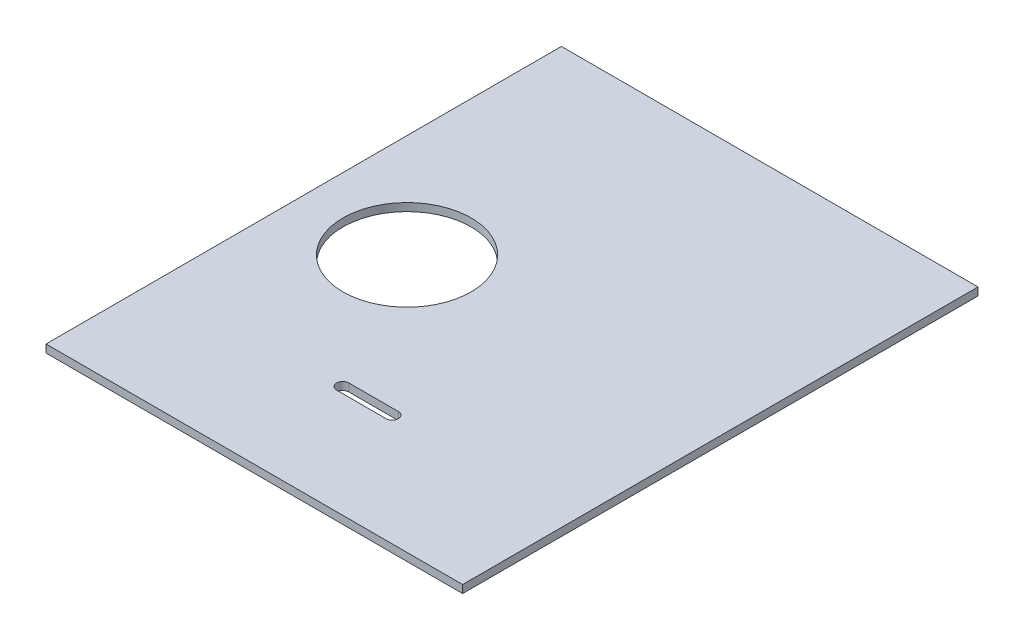
ISO-10303-21;
HEADER;
FILE_DESCRIPTION(('STEP AP214'),'2;1');
FILE_NAME('part.step','',(''),(''),'','','');
FILE_SCHEMA(('AUTOMOTIVE_DESIGN { 1 0 10303 214 1 1 1 1 }'));
ENDSEC;
DATA;
#1=APPLICATION_CONTEXT('core data for automotive mechanical design processes');
#2=APPLICATION_PROTOCOL_DEFINITION('international standard','automotive_design',2000,#1);
#3=PRODUCT_CONTEXT('',#1,'mechanical');
#4=PRODUCT('Part','Part','',(#3));
#5=PRODUCT_RELATED_PRODUCT_CATEGORY('part','',(#4));
#6=PRODUCT_DEFINITION_FORMATION('','',#4);
#7=PRODUCT_DEFINITION_CONTEXT('part definition',#1,'design');
#8=PRODUCT_DEFINITION('design','',#6,#7);
#9=PRODUCT_DEFINITION_SHAPE('','',#8);
#10=(LENGTH_UNIT() NAMED_UNIT(*) SI_UNIT(.MILLI.,.METRE.));
#11=(NAMED_UNIT(*) PLANE_ANGLE_UNIT() SI_UNIT($,.RADIAN.));
#12=(NAMED_UNIT(*) SI_UNIT($,.STERADIAN.) SOLID_ANGLE_UNIT());
#13=UNCERTAINTY_MEASURE_WITH_UNIT(LENGTH_MEASURE(1.E-05),#10,'distance_accuracy_value','');
#14=(GEOMETRIC_REPRESENTATION_CONTEXT(3) GLOBAL_UNCERTAINTY_ASSIGNED_CONTEXT((#13)) GLOBAL_UNIT_ASSIGNED_CONTEXT((#10,
#11,#12)) REPRESENTATION_CONTEXT('',''));
#15=CARTESIAN_POINT('',(0.,0.,0.));
#16=DIRECTION('',(0.,0.,1.));
#17=DIRECTION('',(1.,0.,0.));
#18=AXIS2_PLACEMENT_3D('',#15,#16,#17);
#19=CARTESIAN_POINT('',(84.325,3.18,104.325));
#20=DIRECTION('',(-1.,0.,0.));
#21=DIRECTION('',(0.,0.,1.));
#22=AXIS2_PLACEMENT_3D('',#19,#20,#21);
#23=PLANE('',#22);
#24=DIRECTION('',(0.,0.,-1.));
#25=VECTOR('',#24,1.);
#26=CARTESIAN_POINT('',(84.325,0.,104.325));
#27=LINE('',#26,#25);
#28=CARTESIAN_POINT('',(84.325,0.,104.325));
#29=VERTEX_POINT('',#28);
#30=CARTESIAN_POINT('',(84.325,0.,-104.325));
#31=VERTEX_POINT('',#30);
#32=EDGE_CURVE('E102',#29,#31,#27,.T.);
#33=ORIENTED_EDGE('',*,*,#32,.T.);
#34=DIRECTION('',(0.,-1.,0.));
#35=VECTOR('',#34,1.);
#36=CARTESIAN_POINT('',(84.325,3.18,-104.325));
#37=LINE('',#36,#35);
#38=CARTESIAN_POINT('',(84.325,3.18,-104.325));
#39=VERTEX_POINT('',#38);
#40=EDGE_CURVE('E11',#39,#31,#37,.T.);
#41=ORIENTED_EDGE('',*,*,#40,.F.);
#42=DIRECTION('',(0.,0.,-1.));
#43=VECTOR('',#42,1.);
#44=CARTESIAN_POINT('',(84.325,3.18,104.325));
#45=LINE('',#44,#43);
#46=CARTESIAN_POINT('',(84.325,3.18,104.325));
#47=VERTEX_POINT('',#46);
#48=EDGE_CURVE('E131',#47,#39,#45,.T.);
#49=ORIENTED_EDGE('',*,*,#48,.F.);
#50=DIRECTION('',(0.,-1.,0.));
#51=VECTOR('',#50,1.);
#52=CARTESIAN_POINT('',(84.325,3.18,104.325));
#53=LINE('',#52,#51);
#54=EDGE_CURVE('E141',#47,#29,#53,.T.);
#55=ORIENTED_EDGE('',*,*,#54,.T.);
#56=EDGE_LOOP('',(#33,#41,#49,#55));
#57=FACE_BOUND('',#56,.T.);
#58=ADVANCED_FACE('F32',(#57),#23,.F.);
#59=CARTESIAN_POINT('',(-84.325,3.18,-104.325));
#60=DIRECTION('',(0.,0.,1.));
#61=DIRECTION('',(1.,0.,0.));
#62=AXIS2_PLACEMENT_3D('',#59,#60,#61);
#63=PLANE('',#62);
#64=DIRECTION('',(-1.,0.,0.));
#65=VECTOR('',#64,1.);
#66=CARTESIAN_POINT('',(-84.325,0.,-104.325));
#67=LINE('',#66,#65);
#68=CARTESIAN_POINT('',(-84.325,0.,-104.325));
#69=VERTEX_POINT('',#68);
#70=EDGE_CURVE('E144',#31,#69,#67,.T.);
#71=ORIENTED_EDGE('',*,*,#70,.T.);
#72=DIRECTION('',(0.,-1.,0.));
#73=VECTOR('',#72,1.);
#74=CARTESIAN_POINT('',(-84.325,3.18,-104.325));
#75=LINE('',#74,#73);
#76=CARTESIAN_POINT('',(-84.325,3.18,-104.325));
#77=VERTEX_POINT('',#76);
#78=EDGE_CURVE('E39',#77,#69,#75,.T.);
#79=ORIENTED_EDGE('',*,*,#78,.F.);
#80=DIRECTION('',(-1.,0.,0.));
#81=VECTOR('',#80,1.);
#82=CARTESIAN_POINT('',(-84.325,3.18,-104.325));
#83=LINE('',#82,#81);
#84=EDGE_CURVE('E134',#39,#77,#83,.T.);
#85=ORIENTED_EDGE('',*,*,#84,.F.);
#86=ORIENTED_EDGE('',*,*,#40,.T.);
#87=EDGE_LOOP('',(#71,#79,#85,#86));
#88=FACE_BOUND('',#87,.T.);
#89=ADVANCED_FACE('F172',(#88),#63,.F.);
#90=CARTESIAN_POINT('',(-84.325,3.18,104.325));
#91=DIRECTION('',(1.,0.,0.));
#92=DIRECTION('',(0.,0.,-1.));
#93=AXIS2_PLACEMENT_3D('',#90,#91,#92);
#94=PLANE('',#93);
#95=DIRECTION('',(0.,0.,1.));
#96=VECTOR('',#95,1.);
#97=CARTESIAN_POINT('',(-84.325,0.,104.325));
#98=LINE('',#97,#96);
#99=CARTESIAN_POINT('',(-84.325,0.,104.325));
#100=VERTEX_POINT('',#99);
#101=EDGE_CURVE('E146',#69,#100,#98,.T.);
#102=ORIENTED_EDGE('',*,*,#101,.T.);
#103=DIRECTION('',(0.,-1.,0.));
#104=VECTOR('',#103,1.);
#105=CARTESIAN_POINT('',(-84.325,3.18,104.325));
#106=LINE('',#105,#104);
#107=CARTESIAN_POINT('',(-84.325,3.18,104.325));
#108=VERTEX_POINT('',#107);
#109=EDGE_CURVE('E151',#108,#100,#106,.T.);
#110=ORIENTED_EDGE('',*,*,#109,.F.);
#111=DIRECTION('',(0.,0.,1.));
#112=VECTOR('',#111,1.);
#113=CARTESIAN_POINT('',(-84.325,3.18,104.325));
#114=LINE('',#113,#112);
#115=EDGE_CURVE('E137',#77,#108,#114,.T.);
#116=ORIENTED_EDGE('',*,*,#115,.F.);
#117=ORIENTED_EDGE('',*,*,#78,.T.);
#118=EDGE_LOOP('',(#102,#110,#116,#117));
#119=FACE_BOUND('',#118,.T.);
#120=ADVANCED_FACE('F158',(#119),#94,.F.);
#121=CARTESIAN_POINT('',(-84.325,3.18,104.325));
#122=DIRECTION('',(0.,0.,-1.));
#123=DIRECTION('',(-1.,0.,0.));
#124=AXIS2_PLACEMENT_3D('',#121,#122,#123);
#125=PLANE('',#124);
#126=DIRECTION('',(1.,0.,0.));
#127=VECTOR('',#126,1.);
#128=CARTESIAN_POINT('',(-84.325,0.,104.325));
#129=LINE('',#128,#127);
#130=EDGE_CURVE('E135',#100,#29,#129,.T.);
#131=ORIENTED_EDGE('',*,*,#130,.T.);
#132=ORIENTED_EDGE('',*,*,#54,.F.);
#133=DIRECTION('',(1.,0.,0.));
#134=VECTOR('',#133,1.);
#135=CARTESIAN_POINT('',(-84.325,3.18,104.325));
#136=LINE('',#135,#134);
#137=EDGE_CURVE('E139',#108,#47,#136,.T.);
#138=ORIENTED_EDGE('',*,*,#137,.F.);
#139=ORIENTED_EDGE('',*,*,#109,.T.);
#140=EDGE_LOOP('',(#131,#132,#138,#139));
#141=FACE_BOUND('',#140,.T.);
#142=ADVANCED_FACE('F165',(#141),#125,.F.);
#143=CARTESIAN_POINT('',(0.,3.18,0.));
#144=DIRECTION('',(0.,-1.,0.));
#145=DIRECTION('',(0.,0.,-1.));
#146=AXIS2_PLACEMENT_3D('',#143,#144,#145);
#147=PLANE('',#146);
#148=CARTESIAN_POINT('',(-42.4824999999876,3.18,-2.22044604925031E-12));
#149=DIRECTION('',(0.,1.,0.));
#150=DIRECTION('',(0.,0.,1.));
#151=AXIS2_PLACEMENT_3D('',#148,#149,#150);
#152=CIRCLE('',#151,25.9511033983043);
#153=CARTESIAN_POINT('',(-42.4824999999876,3.18,25.9511033983021));
#154=VERTEX_POINT('',#153);
#155=EDGE_CURVE('E211',#154,#154,#152,.T.);
#156=ORIENTED_EDGE('',*,*,#155,.F.);
#157=EDGE_LOOP('',(#156));
#158=FACE_BOUND('',#157,.T.);
#159=DIRECTION('',(1.,0.,0.));
#160=VECTOR('',#159,1.);
#161=CARTESIAN_POINT('',(-9.32500000000008,3.18,61.6749999999998));
#162=LINE('',#161,#160);
#163=CARTESIAN_POINT('',(-9.32500000000008,3.18,61.6749999999998));
#164=VERTEX_POINT('',#163);
#165=CARTESIAN_POINT('',(10.6749999999999,3.18,61.6749999999998));
#166=VERTEX_POINT('',#165);
#167=EDGE_CURVE('E115',#164,#166,#162,.T.);
#168=ORIENTED_EDGE('',*,*,#167,.F.);
#169=CARTESIAN_POINT('',(-9.32500000000008,3.18,59.1749999999998));
#170=DIRECTION('',(0.,1.,0.));
#171=DIRECTION('',(0.,0.,1.));
#172=AXIS2_PLACEMENT_3D('',#169,#170,#171);
#173=CIRCLE('',#172,2.5);
#174=CARTESIAN_POINT('',(-9.32500000000008,3.18,56.6749999999998));
#175=VERTEX_POINT('',#174);
#176=EDGE_CURVE('E46',#175,#164,#173,.T.);
#177=ORIENTED_EDGE('',*,*,#176,.F.);
#178=DIRECTION('',(-1.,0.,0.));
#179=VECTOR('',#178,1.);
#180=CARTESIAN_POINT('',(10.6749999999999,3.18,56.6749999999998));
#181=LINE('',#180,#179);
#182=CARTESIAN_POINT('',(10.6749999999999,3.18,56.6749999999998));
#183=VERTEX_POINT('',#182);
#184=EDGE_CURVE('E108',#183,#175,#181,.T.);
#185=ORIENTED_EDGE('',*,*,#184,.F.);
#186=CARTESIAN_POINT('',(10.6749999999999,3.18,59.1749999999998));
#187=DIRECTION('',(0.,1.,0.));
#188=DIRECTION('',(0.,0.,1.));
#189=AXIS2_PLACEMENT_3D('',#186,#187,#188);
#190=CIRCLE('',#189,2.5);
#191=EDGE_CURVE('E122',#166,#183,#190,.T.);
#192=ORIENTED_EDGE('',*,*,#191,.F.);
#193=EDGE_LOOP('',(#168,#177,#185,#192));
#194=FACE_BOUND('',#193,.T.);
#195=ORIENTED_EDGE('',*,*,#48,.T.);
#196=ORIENTED_EDGE('',*,*,#84,.T.);
#197=ORIENTED_EDGE('',*,*,#115,.T.);
#198=ORIENTED_EDGE('',*,*,#137,.T.);
#199=EDGE_LOOP('',(#195,#196,#197,#198));
#200=FACE_BOUND('',#199,.T.);
#201=ADVANCED_FACE('F171',(#158,#194,#200),#147,.F.);
#202=CARTESIAN_POINT('',(0.,0.,0.));
#203=DIRECTION('',(0.,-1.,0.));
#204=DIRECTION('',(0.,0.,-1.));
#205=AXIS2_PLACEMENT_3D('',#202,#203,#204);
#206=PLANE('',#205);
#207=CARTESIAN_POINT('',(-42.4824999999876,0.,-2.22044604925031E-12));
#208=DIRECTION('',(0.,-1.,0.));
#209=DIRECTION('',(0.,0.,-1.));
#210=AXIS2_PLACEMENT_3D('',#207,#208,#209);
#211=CIRCLE('',#210,25.9511033983043);
#212=CARTESIAN_POINT('',(-42.4824999999876,0.,25.9511033983021));
#213=VERTEX_POINT('',#212);
#214=EDGE_CURVE('E208',#213,#213,#211,.F.);
#215=ORIENTED_EDGE('',*,*,#214,.T.);
#216=EDGE_LOOP('',(#215));
#217=FACE_BOUND('',#216,.T.);
#218=CARTESIAN_POINT('',(-9.32500000000008,0.,59.1749999999998));
#219=DIRECTION('',(0.,-1.,0.));
#220=DIRECTION('',(0.,0.,-1.));
#221=AXIS2_PLACEMENT_3D('',#218,#219,#220);
#222=CIRCLE('',#221,2.5);
#223=CARTESIAN_POINT('',(-9.32500000000008,0.,56.6749999999998));
#224=VERTEX_POINT('',#223);
#225=CARTESIAN_POINT('',(-9.32500000000008,0.,61.6749999999998));
#226=VERTEX_POINT('',#225);
#227=EDGE_CURVE('E106',#224,#226,#222,.F.);
#228=ORIENTED_EDGE('',*,*,#227,.T.);
#229=DIRECTION('',(1.,0.,0.));
#230=VECTOR('',#229,1.);
#231=CARTESIAN_POINT('',(-9.32500000000008,0.,61.6749999999998));
#232=LINE('',#231,#230);
#233=CARTESIAN_POINT('',(10.6749999999999,0.,61.6749999999998));
#234=VERTEX_POINT('',#233);
#235=EDGE_CURVE('E95',#226,#234,#232,.T.);
#236=ORIENTED_EDGE('',*,*,#235,.T.);
#237=CARTESIAN_POINT('',(10.6749999999999,0.,59.1749999999998));
#238=DIRECTION('',(0.,-1.,0.));
#239=DIRECTION('',(0.,0.,-1.));
#240=AXIS2_PLACEMENT_3D('',#237,#238,#239);
#241=CIRCLE('',#240,2.5);
#242=CARTESIAN_POINT('',(10.6749999999999,0.,56.6749999999998));
#243=VERTEX_POINT('',#242);
#244=EDGE_CURVE('E117',#234,#243,#241,.F.);
#245=ORIENTED_EDGE('',*,*,#244,.T.);
#246=DIRECTION('',(-1.,0.,0.));
#247=VECTOR('',#246,1.);
#248=CARTESIAN_POINT('',(10.6749999999999,0.,56.6749999999998));
#249=LINE('',#248,#247);
#250=EDGE_CURVE('E113',#243,#224,#249,.T.);
#251=ORIENTED_EDGE('',*,*,#250,.T.);
#252=EDGE_LOOP('',(#228,#236,#245,#251));
#253=FACE_BOUND('',#252,.T.);
#254=ORIENTED_EDGE('',*,*,#32,.F.);
#255=ORIENTED_EDGE('',*,*,#130,.F.);
#256=ORIENTED_EDGE('',*,*,#101,.F.);
#257=ORIENTED_EDGE('',*,*,#70,.F.);
#258=EDGE_LOOP('',(#254,#255,#256,#257));
#259=FACE_BOUND('',#258,.T.);
#260=ADVANCED_FACE('F111',(#217,#253,#259),#206,.T.);
#261=CARTESIAN_POINT('',(-9.32500000000008,-0.00100000000000013,59.1749999999998));
#262=DIRECTION('',(0.,1.,0.));
#263=DIRECTION('',(0.,0.,1.));
#264=AXIS2_PLACEMENT_3D('',#261,#262,#263);
#265=CYLINDRICAL_SURFACE('',#264,2.5);
#266=DIRECTION('',(0.,1.,0.));
#267=VECTOR('',#266,1.);
#268=CARTESIAN_POINT('',(-9.32500000000008,-0.00100000000000013,56.6749999999998));
#269=LINE('',#268,#267);
#270=EDGE_CURVE('E103',#224,#175,#269,.T.);
#271=ORIENTED_EDGE('',*,*,#270,.T.);
#272=ORIENTED_EDGE('',*,*,#176,.T.);
#273=DIRECTION('',(0.,1.,0.));
#274=VECTOR('',#273,1.);
#275=CARTESIAN_POINT('',(-9.32500000000008,-0.00100000000000013,61.6749999999998));
#276=LINE('',#275,#274);
#277=EDGE_CURVE('E97',#226,#164,#276,.T.);
#278=ORIENTED_EDGE('',*,*,#277,.F.);
#279=ORIENTED_EDGE('',*,*,#227,.F.);
#280=EDGE_LOOP('',(#271,#272,#278,#279));
#281=FACE_BOUND('',#280,.T.);
#282=ADVANCED_FACE('F105',(#281),#265,.F.);
#283=CARTESIAN_POINT('',(10.6749999999999,-0.00100000000000013,56.6749999999998));
#284=DIRECTION('',(0.,0.,-1.));
#285=DIRECTION('',(-1.,0.,0.));
#286=AXIS2_PLACEMENT_3D('',#283,#284,#285);
#287=PLANE('',#286);
#288=DIRECTION('',(0.,1.,0.));
#289=VECTOR('',#288,1.);
#290=CARTESIAN_POINT('',(10.6749999999999,-0.00100000000000013,56.6749999999998));
#291=LINE('',#290,#289);
#292=EDGE_CURVE('E128',#243,#183,#291,.T.);
#293=ORIENTED_EDGE('',*,*,#292,.T.);
#294=ORIENTED_EDGE('',*,*,#184,.T.);
#295=ORIENTED_EDGE('',*,*,#270,.F.);
#296=ORIENTED_EDGE('',*,*,#250,.F.);
#297=EDGE_LOOP('',(#293,#294,#295,#296));
#298=FACE_BOUND('',#297,.T.);
#299=ADVANCED_FACE('F190',(#298),#287,.F.);
#300=CARTESIAN_POINT('',(10.6749999999999,-0.00100000000000013,59.1749999999998));
#301=DIRECTION('',(0.,1.,0.));
#302=DIRECTION('',(0.,0.,1.));
#303=AXIS2_PLACEMENT_3D('',#300,#301,#302);
#304=CYLINDRICAL_SURFACE('',#303,2.5);
#305=DIRECTION('',(0.,1.,0.));
#306=VECTOR('',#305,1.);
#307=CARTESIAN_POINT('',(10.6749999999999,-0.00100000000000013,61.6749999999998));
#308=LINE('',#307,#306);
#309=EDGE_CURVE('E54',#234,#166,#308,.T.);
#310=ORIENTED_EDGE('',*,*,#309,.T.);
#311=ORIENTED_EDGE('',*,*,#191,.T.);
#312=ORIENTED_EDGE('',*,*,#292,.F.);
#313=ORIENTED_EDGE('',*,*,#244,.F.);
#314=EDGE_LOOP('',(#310,#311,#312,#313));
#315=FACE_BOUND('',#314,.T.);
#316=ADVANCED_FACE('F194',(#315),#304,.F.);
#317=CARTESIAN_POINT('',(-9.32500000000008,-0.00100000000000013,61.6749999999998));
#318=DIRECTION('',(0.,0.,1.));
#319=DIRECTION('',(1.,0.,0.));
#320=AXIS2_PLACEMENT_3D('',#317,#318,#319);
#321=PLANE('',#320);
#322=ORIENTED_EDGE('',*,*,#277,.T.);
#323=ORIENTED_EDGE('',*,*,#167,.T.);
#324=ORIENTED_EDGE('',*,*,#309,.F.);
#325=ORIENTED_EDGE('',*,*,#235,.F.);
#326=EDGE_LOOP('',(#322,#323,#324,#325));
#327=FACE_BOUND('',#326,.T.);
#328=ADVANCED_FACE('F96',(#327),#321,.F.);
#329=CARTESIAN_POINT('',(-42.4824999999876,-0.00100000000000013,-2.22044604925031E-12));
#330=DIRECTION('',(0.,1.,0.));
#331=DIRECTION('',(0.,0.,1.));
#332=AXIS2_PLACEMENT_3D('',#329,#330,#331);
#333=CYLINDRICAL_SURFACE('',#332,25.9511033983043);
#334=CARTESIAN_POINT('',(-42.4824999999876,0.,25.9511033983021));
#335=CARTESIAN_POINT('',(-42.4824999999876,0.033125,25.9511033983021));
#336=CARTESIAN_POINT('',(-42.4824999999876,0.06625,25.9511033983021));
#337=CARTESIAN_POINT('',(-42.4824999999876,0.1325,25.9511033983021));
#338=CARTESIAN_POINT('',(-42.4824999999876,0.165625,25.9511033983021));
#339=CARTESIAN_POINT('',(-42.4824999999876,0.231875,25.9511033983021));
#340=CARTESIAN_POINT('',(-42.4824999999876,0.265,25.9511033983021));
#341=CARTESIAN_POINT('',(-42.4824999999876,0.33125,25.9511033983021));
#342=CARTESIAN_POINT('',(-42.4824999999876,0.364375,25.9511033983021));
#343=CARTESIAN_POINT('',(-42.4824999999876,0.430625,25.9511033983021));
#344=CARTESIAN_POINT('',(-42.4824999999876,0.46375,25.9511033983021));
#345=CARTESIAN_POINT('',(-42.4824999999876,0.53,25.9511033983021));
#346=CARTESIAN_POINT('',(-42.4824999999876,0.563125,25.9511033983021));
#347=CARTESIAN_POINT('',(-42.4824999999876,0.629375,25.9511033983021));
#348=CARTESIAN_POINT('',(-42.4824999999876,0.6625,25.9511033983021));
#349=CARTESIAN_POINT('',(-42.4824999999876,0.72875,25.9511033983021));
#350=CARTESIAN_POINT('',(-42.4824999999876,0.761875,25.9511033983021));
#351=CARTESIAN_POINT('',(-42.4824999999876,0.828125,25.9511033983021));
#352=CARTESIAN_POINT('',(-42.4824999999876,0.86125,25.9511033983021));
#353=CARTESIAN_POINT('',(-42.4824999999876,0.9275,25.9511033983021));
#354=CARTESIAN_POINT('',(-42.4824999999876,0.960625,25.9511033983021));
#355=CARTESIAN_POINT('',(-42.4824999999876,1.026875,25.9511033983021));
#356=CARTESIAN_POINT('',(-42.4824999999876,1.06,25.9511033983021));
#357=CARTESIAN_POINT('',(-42.4824999999876,1.12625,25.9511033983021));
#358=CARTESIAN_POINT('',(-42.4824999999876,1.159375,25.9511033983021));
#359=CARTESIAN_POINT('',(-42.4824999999876,1.225625,25.9511033983021));
#360=CARTESIAN_POINT('',(-42.4824999999876,1.25875,25.9511033983021));
#361=CARTESIAN_POINT('',(-42.4824999999876,1.325,25.9511033983021));
#362=CARTESIAN_POINT('',(-42.4824999999876,1.358125,25.9511033983021));
#363=CARTESIAN_POINT('',(-42.4824999999876,1.424375,25.9511033983021));
#364=CARTESIAN_POINT('',(-42.4824999999876,1.4575,25.9511033983021));
#365=CARTESIAN_POINT('',(-42.4824999999876,1.52375,25.9511033983021));
#366=CARTESIAN_POINT('',(-42.4824999999876,1.556875,25.9511033983021));
#367=CARTESIAN_POINT('',(-42.4824999999876,1.623125,25.9511033983021));
#368=CARTESIAN_POINT('',(-42.4824999999876,1.65625,25.9511033983021));
#369=CARTESIAN_POINT('',(-42.4824999999876,1.7225,25.9511033983021));
#370=CARTESIAN_POINT('',(-42.4824999999876,1.755625,25.9511033983021));
#371=CARTESIAN_POINT('',(-42.4824999999876,1.821875,25.9511033983021));
#372=CARTESIAN_POINT('',(-42.4824999999876,1.855,25.9511033983021));
#373=CARTESIAN_POINT('',(-42.4824999999876,1.92125,25.9511033983021));
#374=CARTESIAN_POINT('',(-42.4824999999876,1.954375,25.9511033983021));
#375=CARTESIAN_POINT('',(-42.4824999999876,2.020625,25.9511033983021));
#376=CARTESIAN_POINT('',(-42.4824999999876,2.05375,25.9511033983021));
#377=CARTESIAN_POINT('',(-42.4824999999876,2.12,25.9511033983021));
#378=CARTESIAN_POINT('',(-42.4824999999876,2.153125,25.9511033983021));
#379=CARTESIAN_POINT('',(-42.4824999999876,2.219375,25.9511033983021));
#380=CARTESIAN_POINT('',(-42.4824999999876,2.2525,25.9511033983021));
#381=CARTESIAN_POINT('',(-42.4824999999876,2.31875,25.9511033983021));
#382=CARTESIAN_POINT('',(-42.4824999999876,2.351875,25.9511033983021));
#383=CARTESIAN_POINT('',(-42.4824999999876,2.418125,25.9511033983021));
#384=CARTESIAN_POINT('',(-42.4824999999876,2.45125,25.9511033983021));
#385=CARTESIAN_POINT('',(-42.4824999999876,2.5175,25.9511033983021));
#386=CARTESIAN_POINT('',(-42.4824999999876,2.550625,25.9511033983021));
#387=CARTESIAN_POINT('',(-42.4824999999876,2.616875,25.9511033983021));
#388=CARTESIAN_POINT('',(-42.4824999999876,2.65,25.9511033983021));
#389=CARTESIAN_POINT('',(-42.4824999999876,2.71625,25.9511033983021));
#390=CARTESIAN_POINT('',(-42.4824999999876,2.749375,25.9511033983021));
#391=CARTESIAN_POINT('',(-42.4824999999876,2.815625,25.9511033983021));
#392=CARTESIAN_POINT('',(-42.4824999999876,2.84875,25.9511033983021));
#393=CARTESIAN_POINT('',(-42.4824999999876,2.915,25.9511033983021));
#394=CARTESIAN_POINT('',(-42.4824999999876,2.948125,25.9511033983021));
#395=CARTESIAN_POINT('',(-42.4824999999876,3.014375,25.9511033983021));
#396=CARTESIAN_POINT('',(-42.4824999999876,3.0475,25.9511033983021));
#397=CARTESIAN_POINT('',(-42.4824999999876,3.11375,25.9511033983021));
#398=CARTESIAN_POINT('',(-42.4824999999876,3.146875,25.9511033983021));
#399=CARTESIAN_POINT('',(-42.4824999999876,3.18,25.9511033983021));
#400=B_SPLINE_CURVE_WITH_KNOTS('',3,(#334,#335,#336,#337,#338,#339,#340,#341,#342,#343,#344,
#345,#346,#347,#348,#349,#350,#351,#352,#353,#354,#355,#356,#357,#358,#359,#360,#361,#362,#363,
#364,#365,#366,#367,#368,#369,#370,#371,#372,#373,#374,#375,#376,#377,#378,#379,#380,#381,#382,
#383,#384,#385,#386,#387,#388,#389,#390,#391,#392,#393,#394,#395,#396,#397,#398,#399),
.UNSPECIFIED.,.F.,.F.,(4,2,2,2,2,2,2,2,2,2,2,2,2,2,2,2,2,2,2,2,2,2,2,2,2,2,2,2,2,2,2,2,4),(0.,
0.099375,0.19875,0.298125,0.3975,0.496875,0.59625,0.695625,0.795,0.894375,0.99375,1.093125,
1.1925,1.291875,1.39125,1.490625,1.59,1.689375,1.78875,1.888125,1.9875,2.086875,2.18625,
2.285625,2.385,2.484375,2.58375,2.683125,2.7825,2.881875,2.98125,3.080625,3.18),.UNSPECIFIED.);
#401=EDGE_CURVE('BSEAM193',#213,#154,#400,.T.);
#402=ORIENTED_EDGE('',*,*,#214,.F.);
#403=ORIENTED_EDGE('',*,*,#155,.T.);
#404=ORIENTED_EDGE('',*,*,#401,.T.);
#405=ORIENTED_EDGE('',*,*,#401,.F.);
#406=EDGE_LOOP('',(#402,#404,#403,#405));
#407=FACE_BOUND('',#406,.T.);
#408=ADVANCED_FACE('F193',(#407),#333,.F.);
#409=CLOSED_SHELL('',(#58,#89,#120,#142,#201,#260,#282,#299,#316,#328,#408));
#410=MANIFOLD_SOLID_BREP('B2',#409);
#411=ADVANCED_BREP_SHAPE_REPRESENTATION('',(#18,#410),#14);
#412=SHAPE_DEFINITION_REPRESENTATION(#9,#411);
ENDSEC;
END-ISO-10303-21;
